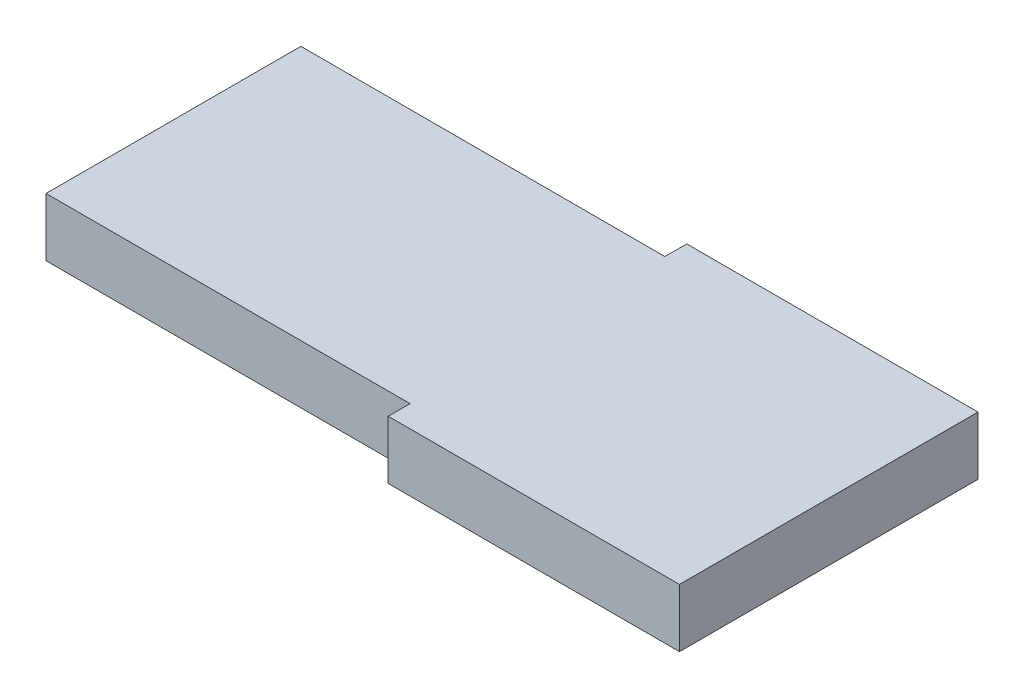
ISO-10303-21;
HEADER;
FILE_DESCRIPTION(('STEP AP214'),'2;1');
FILE_NAME('part.step','',(''),(''),'','','');
FILE_SCHEMA(('AUTOMOTIVE_DESIGN { 1 0 10303 214 1 1 1 1 }'));
ENDSEC;
DATA;
#1=APPLICATION_CONTEXT('core data for automotive mechanical design processes');
#2=APPLICATION_PROTOCOL_DEFINITION('international standard','automotive_design',2000,#1);
#3=PRODUCT_CONTEXT('',#1,'mechanical');
#4=PRODUCT('Part','Part','',(#3));
#5=PRODUCT_RELATED_PRODUCT_CATEGORY('part','',(#4));
#6=PRODUCT_DEFINITION_FORMATION('','',#4);
#7=PRODUCT_DEFINITION_CONTEXT('part definition',#1,'design');
#8=PRODUCT_DEFINITION('design','',#6,#7);
#9=PRODUCT_DEFINITION_SHAPE('','',#8);
#10=(LENGTH_UNIT() NAMED_UNIT(*) SI_UNIT(.MILLI.,.METRE.));
#11=(NAMED_UNIT(*) PLANE_ANGLE_UNIT() SI_UNIT($,.RADIAN.));
#12=(NAMED_UNIT(*) SI_UNIT($,.STERADIAN.) SOLID_ANGLE_UNIT());
#13=UNCERTAINTY_MEASURE_WITH_UNIT(LENGTH_MEASURE(1.E-05),#10,'distance_accuracy_value','');
#14=(GEOMETRIC_REPRESENTATION_CONTEXT(3) GLOBAL_UNCERTAINTY_ASSIGNED_CONTEXT((#13)) GLOBAL_UNIT_ASSIGNED_CONTEXT((#10,
#11,#12)) REPRESENTATION_CONTEXT('',''));
#15=CARTESIAN_POINT('',(0.,0.,0.));
#16=DIRECTION('',(0.,0.,1.));
#17=DIRECTION('',(1.,0.,0.));
#18=AXIS2_PLACEMENT_3D('',#15,#16,#17);
#19=CARTESIAN_POINT('',(0.,8.,-20.5));
#20=DIRECTION('',(0.,0.,-1.));
#21=DIRECTION('',(-1.,0.,0.));
#22=AXIS2_PLACEMENT_3D('',#19,#20,#21);
#23=PLANE('',#22);
#24=DIRECTION('',(1.,0.,0.));
#25=VECTOR('',#24,1.);
#26=CARTESIAN_POINT('',(0.,0.,-20.5));
#27=LINE('',#26,#25);
#28=CARTESIAN_POINT('',(25.,0.,-20.5));
#29=VERTEX_POINT('',#28);
#30=CARTESIAN_POINT('',(65.,0.,-20.5));
#31=VERTEX_POINT('',#30);
#32=EDGE_CURVE('E142',#29,#31,#27,.T.);
#33=ORIENTED_EDGE('',*,*,#32,.F.);
#34=DIRECTION('',(0.,-1.,0.));
#35=VECTOR('',#34,1.);
#36=CARTESIAN_POINT('',(25.,8.,-20.5));
#37=LINE('',#36,#35);
#38=CARTESIAN_POINT('',(25.,8.,-20.5));
#39=VERTEX_POINT('',#38);
#40=EDGE_CURVE('E11',#39,#29,#37,.T.);
#41=ORIENTED_EDGE('',*,*,#40,.F.);
#42=DIRECTION('',(1.,0.,0.));
#43=VECTOR('',#42,1.);
#44=CARTESIAN_POINT('',(0.,8.,-20.5));
#45=LINE('',#44,#43);
#46=CARTESIAN_POINT('',(65.,8.,-20.5));
#47=VERTEX_POINT('',#46);
#48=EDGE_CURVE('E168',#39,#47,#45,.T.);
#49=ORIENTED_EDGE('',*,*,#48,.T.);
#50=DIRECTION('',(0.,-1.,0.));
#51=VECTOR('',#50,1.);
#52=CARTESIAN_POINT('',(65.,8.,-20.5));
#53=LINE('',#52,#51);
#54=EDGE_CURVE('E57',#47,#31,#53,.T.);
#55=ORIENTED_EDGE('',*,*,#54,.T.);
#56=EDGE_LOOP('',(#33,#41,#49,#55));
#57=FACE_BOUND('',#56,.T.);
#58=ADVANCED_FACE('F40',(#57),#23,.T.);
#59=CARTESIAN_POINT('',(25.,8.,0.));
#60=DIRECTION('',(1.,0.,0.));
#61=DIRECTION('',(0.,0.,-1.));
#62=AXIS2_PLACEMENT_3D('',#59,#60,#61);
#63=PLANE('',#62);
#64=DIRECTION('',(0.,0.,1.));
#65=VECTOR('',#64,1.);
#66=CARTESIAN_POINT('',(25.,0.,0.));
#67=LINE('',#66,#65);
#68=CARTESIAN_POINT('',(25.,0.,-17.5));
#69=VERTEX_POINT('',#68);
#70=EDGE_CURVE('E145',#29,#69,#67,.T.);
#71=ORIENTED_EDGE('',*,*,#70,.T.);
#72=DIRECTION('',(0.,-1.,0.));
#73=VECTOR('',#72,1.);
#74=CARTESIAN_POINT('',(25.,8.,-17.5));
#75=LINE('',#74,#73);
#76=CARTESIAN_POINT('',(25.,8.,-17.5));
#77=VERTEX_POINT('',#76);
#78=EDGE_CURVE('E49',#77,#69,#75,.T.);
#79=ORIENTED_EDGE('',*,*,#78,.F.);
#80=DIRECTION('',(0.,0.,1.));
#81=VECTOR('',#80,1.);
#82=CARTESIAN_POINT('',(25.,8.,0.));
#83=LINE('',#82,#81);
#84=EDGE_CURVE('E199',#39,#77,#83,.T.);
#85=ORIENTED_EDGE('',*,*,#84,.F.);
#86=ORIENTED_EDGE('',*,*,#40,.T.);
#87=EDGE_LOOP('',(#71,#79,#85,#86));
#88=FACE_BOUND('',#87,.T.);
#89=ADVANCED_FACE('F190',(#88),#63,.F.);
#90=CARTESIAN_POINT('',(0.,8.,-17.5));
#91=DIRECTION('',(0.,0.,-1.));
#92=DIRECTION('',(-1.,0.,0.));
#93=AXIS2_PLACEMENT_3D('',#90,#91,#92);
#94=PLANE('',#93);
#95=DIRECTION('',(1.,0.,0.));
#96=VECTOR('',#95,1.);
#97=CARTESIAN_POINT('',(0.,0.,-17.5));
#98=LINE('',#97,#96);
#99=CARTESIAN_POINT('',(-25.,0.,-17.5));
#100=VERTEX_POINT('',#99);
#101=EDGE_CURVE('E149',#100,#69,#98,.T.);
#102=ORIENTED_EDGE('',*,*,#101,.F.);
#103=DIRECTION('',(0.,-1.,0.));
#104=VECTOR('',#103,1.);
#105=CARTESIAN_POINT('',(-25.,8.,-17.5));
#106=LINE('',#105,#104);
#107=CARTESIAN_POINT('',(-25.,8.,-17.5));
#108=VERTEX_POINT('',#107);
#109=EDGE_CURVE('E178',#108,#100,#106,.T.);
#110=ORIENTED_EDGE('',*,*,#109,.F.);
#111=DIRECTION('',(1.,0.,0.));
#112=VECTOR('',#111,1.);
#113=CARTESIAN_POINT('',(0.,8.,-17.5));
#114=LINE('',#113,#112);
#115=EDGE_CURVE('E187',#108,#77,#114,.T.);
#116=ORIENTED_EDGE('',*,*,#115,.T.);
#117=ORIENTED_EDGE('',*,*,#78,.T.);
#118=EDGE_LOOP('',(#102,#110,#116,#117));
#119=FACE_BOUND('',#118,.T.);
#120=ADVANCED_FACE('F185',(#119),#94,.T.);
#121=CARTESIAN_POINT('',(-25.,8.,0.));
#122=DIRECTION('',(-1.,0.,0.));
#123=DIRECTION('',(0.,0.,1.));
#124=AXIS2_PLACEMENT_3D('',#121,#122,#123);
#125=PLANE('',#124);
#126=DIRECTION('',(0.,0.,-1.));
#127=VECTOR('',#126,1.);
#128=CARTESIAN_POINT('',(-25.,0.,0.));
#129=LINE('',#128,#127);
#130=CARTESIAN_POINT('',(-25.,0.,17.5));
#131=VERTEX_POINT('',#130);
#132=EDGE_CURVE('E153',#131,#100,#129,.T.);
#133=ORIENTED_EDGE('',*,*,#132,.F.);
#134=DIRECTION('',(0.,-1.,0.));
#135=VECTOR('',#134,1.);
#136=CARTESIAN_POINT('',(-25.,8.,17.5));
#137=LINE('',#136,#135);
#138=CARTESIAN_POINT('',(-25.,8.,17.5));
#139=VERTEX_POINT('',#138);
#140=EDGE_CURVE('E175',#139,#131,#137,.T.);
#141=ORIENTED_EDGE('',*,*,#140,.F.);
#142=DIRECTION('',(0.,0.,-1.));
#143=VECTOR('',#142,1.);
#144=CARTESIAN_POINT('',(-25.,8.,0.));
#145=LINE('',#144,#143);
#146=EDGE_CURVE('E198',#139,#108,#145,.T.);
#147=ORIENTED_EDGE('',*,*,#146,.T.);
#148=ORIENTED_EDGE('',*,*,#109,.T.);
#149=EDGE_LOOP('',(#133,#141,#147,#148));
#150=FACE_BOUND('',#149,.T.);
#151=ADVANCED_FACE('F196',(#150),#125,.T.);
#152=CARTESIAN_POINT('',(0.,8.,17.5));
#153=DIRECTION('',(0.,0.,-1.));
#154=DIRECTION('',(-1.,0.,0.));
#155=AXIS2_PLACEMENT_3D('',#152,#153,#154);
#156=PLANE('',#155);
#157=DIRECTION('',(1.,0.,0.));
#158=VECTOR('',#157,1.);
#159=CARTESIAN_POINT('',(0.,0.,17.5));
#160=LINE('',#159,#158);
#161=CARTESIAN_POINT('',(25.,0.,17.5));
#162=VERTEX_POINT('',#161);
#163=EDGE_CURVE('E157',#131,#162,#160,.T.);
#164=ORIENTED_EDGE('',*,*,#163,.T.);
#165=DIRECTION('',(0.,-1.,0.));
#166=VECTOR('',#165,1.);
#167=CARTESIAN_POINT('',(25.,8.,17.5));
#168=LINE('',#167,#166);
#169=CARTESIAN_POINT('',(25.,8.,17.5));
#170=VERTEX_POINT('',#169);
#171=EDGE_CURVE('E130',#170,#162,#168,.T.);
#172=ORIENTED_EDGE('',*,*,#171,.F.);
#173=DIRECTION('',(1.,0.,0.));
#174=VECTOR('',#173,1.);
#175=CARTESIAN_POINT('',(0.,8.,17.5));
#176=LINE('',#175,#174);
#177=EDGE_CURVE('E116',#139,#170,#176,.T.);
#178=ORIENTED_EDGE('',*,*,#177,.F.);
#179=ORIENTED_EDGE('',*,*,#140,.T.);
#180=EDGE_LOOP('',(#164,#172,#178,#179));
#181=FACE_BOUND('',#180,.T.);
#182=ADVANCED_FACE('F229',(#181),#156,.F.);
#183=CARTESIAN_POINT('',(25.,8.,0.));
#184=DIRECTION('',(1.,0.,0.));
#185=DIRECTION('',(0.,0.,-1.));
#186=AXIS2_PLACEMENT_3D('',#183,#184,#185);
#187=PLANE('',#186);
#188=DIRECTION('',(0.,0.,1.));
#189=VECTOR('',#188,1.);
#190=CARTESIAN_POINT('',(25.,0.,0.));
#191=LINE('',#190,#189);
#192=CARTESIAN_POINT('',(25.,0.,20.5));
#193=VERTEX_POINT('',#192);
#194=EDGE_CURVE('E126',#162,#193,#191,.T.);
#195=ORIENTED_EDGE('',*,*,#194,.T.);
#196=DIRECTION('',(0.,-1.,0.));
#197=VECTOR('',#196,1.);
#198=CARTESIAN_POINT('',(25.,8.,20.5));
#199=LINE('',#198,#197);
#200=CARTESIAN_POINT('',(25.,8.,20.5));
#201=VERTEX_POINT('',#200);
#202=EDGE_CURVE('E123',#201,#193,#199,.T.);
#203=ORIENTED_EDGE('',*,*,#202,.F.);
#204=DIRECTION('',(0.,0.,1.));
#205=VECTOR('',#204,1.);
#206=CARTESIAN_POINT('',(25.,8.,0.));
#207=LINE('',#206,#205);
#208=EDGE_CURVE('E107',#170,#201,#207,.T.);
#209=ORIENTED_EDGE('',*,*,#208,.F.);
#210=ORIENTED_EDGE('',*,*,#171,.T.);
#211=EDGE_LOOP('',(#195,#203,#209,#210));
#212=FACE_BOUND('',#211,.T.);
#213=ADVANCED_FACE('F124',(#212),#187,.F.);
#214=CARTESIAN_POINT('',(0.,8.,20.5));
#215=DIRECTION('',(0.,0.,-1.));
#216=DIRECTION('',(-1.,0.,0.));
#217=AXIS2_PLACEMENT_3D('',#214,#215,#216);
#218=PLANE('',#217);
#219=DIRECTION('',(1.,0.,0.));
#220=VECTOR('',#219,1.);
#221=CARTESIAN_POINT('',(0.,0.,20.5));
#222=LINE('',#221,#220);
#223=CARTESIAN_POINT('',(65.,0.,20.5));
#224=VERTEX_POINT('',#223);
#225=EDGE_CURVE('E161',#193,#224,#222,.T.);
#226=ORIENTED_EDGE('',*,*,#225,.T.);
#227=DIRECTION('',(0.,-1.,0.));
#228=VECTOR('',#227,1.);
#229=CARTESIAN_POINT('',(65.,8.,20.5));
#230=LINE('',#229,#228);
#231=CARTESIAN_POINT('',(65.,8.,20.5));
#232=VERTEX_POINT('',#231);
#233=EDGE_CURVE('E83',#232,#224,#230,.T.);
#234=ORIENTED_EDGE('',*,*,#233,.F.);
#235=DIRECTION('',(1.,0.,0.));
#236=VECTOR('',#235,1.);
#237=CARTESIAN_POINT('',(0.,8.,20.5));
#238=LINE('',#237,#236);
#239=EDGE_CURVE('E113',#201,#232,#238,.T.);
#240=ORIENTED_EDGE('',*,*,#239,.F.);
#241=ORIENTED_EDGE('',*,*,#202,.T.);
#242=EDGE_LOOP('',(#226,#234,#240,#241));
#243=FACE_BOUND('',#242,.T.);
#244=ADVANCED_FACE('F132',(#243),#218,.F.);
#245=CARTESIAN_POINT('',(65.,8.,0.));
#246=DIRECTION('',(1.,0.,0.));
#247=DIRECTION('',(0.,0.,-1.));
#248=AXIS2_PLACEMENT_3D('',#245,#246,#247);
#249=PLANE('',#248);
#250=DIRECTION('',(0.,0.,1.));
#251=VECTOR('',#250,1.);
#252=CARTESIAN_POINT('',(65.,0.,0.));
#253=LINE('',#252,#251);
#254=EDGE_CURVE('E164',#31,#224,#253,.T.);
#255=ORIENTED_EDGE('',*,*,#254,.F.);
#256=ORIENTED_EDGE('',*,*,#54,.F.);
#257=DIRECTION('',(0.,0.,1.));
#258=VECTOR('',#257,1.);
#259=CARTESIAN_POINT('',(65.,8.,0.));
#260=LINE('',#259,#258);
#261=EDGE_CURVE('E134',#47,#232,#260,.T.);
#262=ORIENTED_EDGE('',*,*,#261,.T.);
#263=ORIENTED_EDGE('',*,*,#233,.T.);
#264=EDGE_LOOP('',(#255,#256,#262,#263));
#265=FACE_BOUND('',#264,.T.);
#266=ADVANCED_FACE('F208',(#265),#249,.T.);
#267=CARTESIAN_POINT('',(0.,8.,0.));
#268=DIRECTION('',(0.,1.,0.));
#269=DIRECTION('',(0.,0.,1.));
#270=AXIS2_PLACEMENT_3D('',#267,#268,#269);
#271=PLANE('',#270);
#272=ORIENTED_EDGE('',*,*,#48,.F.);
#273=ORIENTED_EDGE('',*,*,#84,.T.);
#274=ORIENTED_EDGE('',*,*,#115,.F.);
#275=ORIENTED_EDGE('',*,*,#146,.F.);
#276=ORIENTED_EDGE('',*,*,#177,.T.);
#277=ORIENTED_EDGE('',*,*,#208,.T.);
#278=ORIENTED_EDGE('',*,*,#239,.T.);
#279=ORIENTED_EDGE('',*,*,#261,.F.);
#280=EDGE_LOOP('',(#272,#273,#274,#275,#276,#277,#278,#279));
#281=FACE_BOUND('',#280,.T.);
#282=ADVANCED_FACE('F110',(#281),#271,.T.);
#283=CARTESIAN_POINT('',(0.,0.,0.));
#284=DIRECTION('',(0.,1.,0.));
#285=DIRECTION('',(0.,0.,1.));
#286=AXIS2_PLACEMENT_3D('',#283,#284,#285);
#287=PLANE('',#286);
#288=ORIENTED_EDGE('',*,*,#32,.T.);
#289=ORIENTED_EDGE('',*,*,#254,.T.);
#290=ORIENTED_EDGE('',*,*,#225,.F.);
#291=ORIENTED_EDGE('',*,*,#194,.F.);
#292=ORIENTED_EDGE('',*,*,#163,.F.);
#293=ORIENTED_EDGE('',*,*,#132,.T.);
#294=ORIENTED_EDGE('',*,*,#101,.T.);
#295=ORIENTED_EDGE('',*,*,#70,.F.);
#296=EDGE_LOOP('',(#288,#289,#290,#291,#292,#293,#294,#295));
#297=FACE_BOUND('',#296,.T.);
#298=ADVANCED_FACE('F192',(#297),#287,.F.);
#299=CLOSED_SHELL('',(#58,#89,#120,#151,#182,#213,#244,#266,#282,#298));
#300=MANIFOLD_SOLID_BREP('B2',#299);
#301=ADVANCED_BREP_SHAPE_REPRESENTATION('',(#18,#300),#14);
#302=SHAPE_DEFINITION_REPRESENTATION(#9,#301);
ENDSEC;
END-ISO-10303-21;
